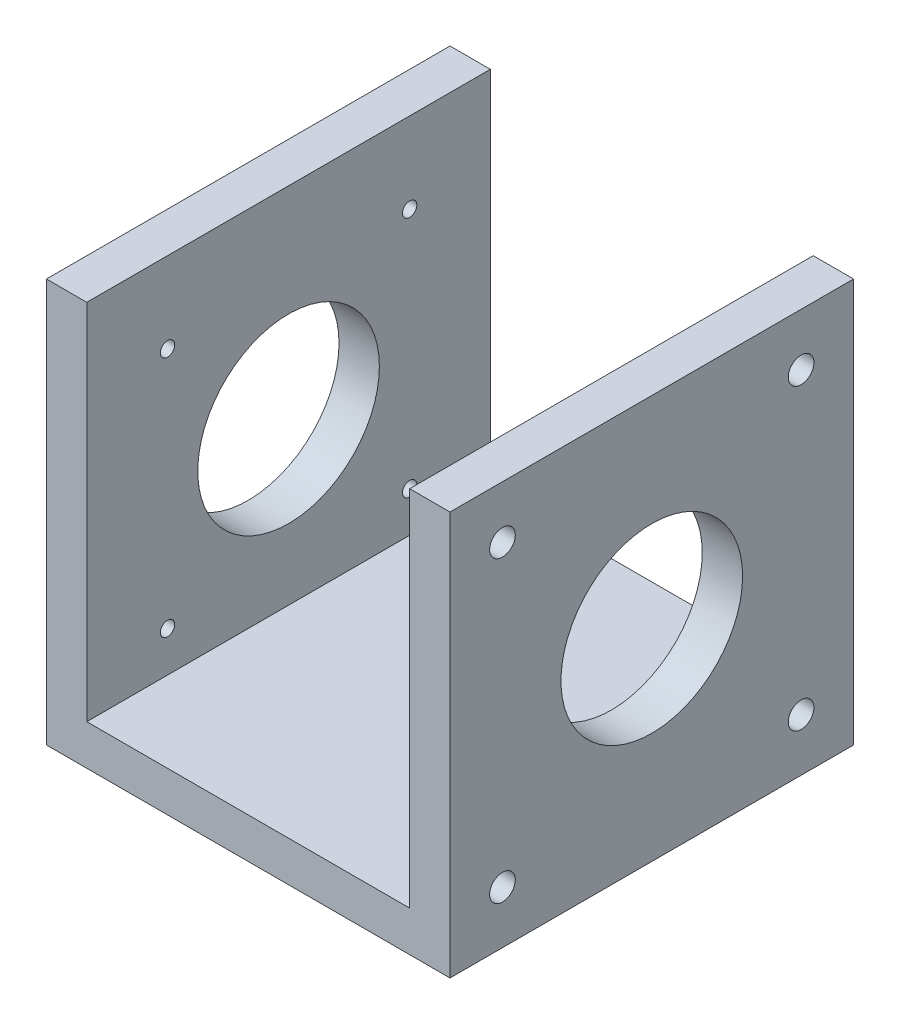
ISO-10303-21;
HEADER;
FILE_DESCRIPTION(('STEP AP214'),'2;1');
FILE_NAME('part.step','',(''),(''),'','','');
FILE_SCHEMA(('AUTOMOTIVE_DESIGN { 1 0 10303 214 1 1 1 1 }'));
ENDSEC;
DATA;
#1=APPLICATION_CONTEXT('core data for automotive mechanical design processes');
#2=APPLICATION_PROTOCOL_DEFINITION('international standard','automotive_design',2000,#1);
#3=PRODUCT_CONTEXT('',#1,'mechanical');
#4=PRODUCT('Part','Part','',(#3));
#5=PRODUCT_RELATED_PRODUCT_CATEGORY('part','',(#4));
#6=PRODUCT_DEFINITION_FORMATION('','',#4);
#7=PRODUCT_DEFINITION_CONTEXT('part definition',#1,'design');
#8=PRODUCT_DEFINITION('design','',#6,#7);
#9=PRODUCT_DEFINITION_SHAPE('','',#8);
#10=(LENGTH_UNIT() NAMED_UNIT(*) SI_UNIT(.MILLI.,.METRE.));
#11=(NAMED_UNIT(*) PLANE_ANGLE_UNIT() SI_UNIT($,.RADIAN.));
#12=(NAMED_UNIT(*) SI_UNIT($,.STERADIAN.) SOLID_ANGLE_UNIT());
#13=UNCERTAINTY_MEASURE_WITH_UNIT(LENGTH_MEASURE(1.E-05),#10,'distance_accuracy_value','');
#14=(GEOMETRIC_REPRESENTATION_CONTEXT(3) GLOBAL_UNCERTAINTY_ASSIGNED_CONTEXT((#13)) GLOBAL_UNIT_ASSIGNED_CONTEXT((#10,
#11,#12)) REPRESENTATION_CONTEXT('',''));
#15=CARTESIAN_POINT('',(0.,0.,0.));
#16=DIRECTION('',(0.,0.,1.));
#17=DIRECTION('',(1.,0.,0.));
#18=AXIS2_PLACEMENT_3D('',#15,#16,#17);
#19=CARTESIAN_POINT('',(0.,63.5,-31.75));
#20=DIRECTION('',(0.,0.,-1.));
#21=DIRECTION('',(-1.,0.,0.));
#22=AXIS2_PLACEMENT_3D('',#19,#20,#21);
#23=PLANE('',#22);
#24=DIRECTION('',(1.,0.,0.));
#25=VECTOR('',#24,1.);
#26=CARTESIAN_POINT('',(0.,0.,-31.75));
#27=LINE('',#26,#25);
#28=CARTESIAN_POINT('',(-31.75,0.,-31.75));
#29=VERTEX_POINT('',#28);
#30=CARTESIAN_POINT('',(31.75,0.,-31.75));
#31=VERTEX_POINT('',#30);
#32=EDGE_CURVE('E273',#29,#31,#27,.T.);
#33=ORIENTED_EDGE('',*,*,#32,.F.);
#34=DIRECTION('',(0.,-1.,0.));
#35=VECTOR('',#34,1.);
#36=CARTESIAN_POINT('',(-31.75,63.5,-31.75));
#37=LINE('',#36,#35);
#38=CARTESIAN_POINT('',(-31.75,63.5,-31.75));
#39=VERTEX_POINT('',#38);
#40=EDGE_CURVE('E169',#39,#29,#37,.T.);
#41=ORIENTED_EDGE('',*,*,#40,.F.);
#42=DIRECTION('',(1.,0.,0.));
#43=VECTOR('',#42,1.);
#44=CARTESIAN_POINT('',(0.,63.5,-31.75));
#45=LINE('',#44,#43);
#46=CARTESIAN_POINT('',(-25.4,63.5,-31.75));
#47=VERTEX_POINT('',#46);
#48=EDGE_CURVE('E191',#39,#47,#45,.T.);
#49=ORIENTED_EDGE('',*,*,#48,.T.);
#50=DIRECTION('',(0.,-1.,0.));
#51=VECTOR('',#50,1.);
#52=CARTESIAN_POINT('',(-25.4,63.5,-31.75));
#53=LINE('',#52,#51);
#54=CARTESIAN_POINT('',(-25.4,6.35,-31.75));
#55=VERTEX_POINT('',#54);
#56=EDGE_CURVE('E164',#47,#55,#53,.T.);
#57=ORIENTED_EDGE('',*,*,#56,.T.);
#58=DIRECTION('',(1.,0.,0.));
#59=VECTOR('',#58,1.);
#60=CARTESIAN_POINT('',(0.,6.35,-31.75));
#61=LINE('',#60,#59);
#62=CARTESIAN_POINT('',(25.4,6.35,-31.75));
#63=VERTEX_POINT('',#62);
#64=EDGE_CURVE('E133',#55,#63,#61,.T.);
#65=ORIENTED_EDGE('',*,*,#64,.T.);
#66=DIRECTION('',(0.,-1.,0.));
#67=VECTOR('',#66,1.);
#68=CARTESIAN_POINT('',(25.4,63.5,-31.75));
#69=LINE('',#68,#67);
#70=CARTESIAN_POINT('',(25.4,63.5,-31.75));
#71=VERTEX_POINT('',#70);
#72=EDGE_CURVE('E132',#71,#63,#69,.T.);
#73=ORIENTED_EDGE('',*,*,#72,.F.);
#74=DIRECTION('',(1.,0.,0.));
#75=VECTOR('',#74,1.);
#76=CARTESIAN_POINT('',(0.,63.5,-31.75));
#77=LINE('',#76,#75);
#78=CARTESIAN_POINT('',(31.75,63.5,-31.75));
#79=VERTEX_POINT('',#78);
#80=EDGE_CURVE('E270',#71,#79,#77,.T.);
#81=ORIENTED_EDGE('',*,*,#80,.T.);
#82=DIRECTION('',(0.,-1.,0.));
#83=VECTOR('',#82,1.);
#84=CARTESIAN_POINT('',(31.75,63.5,-31.75));
#85=LINE('',#84,#83);
#86=EDGE_CURVE('E265',#79,#31,#85,.T.);
#87=ORIENTED_EDGE('',*,*,#86,.T.);
#88=EDGE_LOOP('',(#33,#41,#49,#57,#65,#73,#81,#87));
#89=FACE_BOUND('',#88,.T.);
#90=ADVANCED_FACE('F35',(#89),#23,.T.);
#91=CARTESIAN_POINT('',(25.4,63.5,0.));
#92=DIRECTION('',(1.,0.,0.));
#93=DIRECTION('',(0.,0.,-1.));
#94=AXIS2_PLACEMENT_3D('',#91,#92,#93);
#95=PLANE('',#94);
#96=CARTESIAN_POINT('',(25.4,55.245,23.495));
#97=DIRECTION('',(1.,0.,0.));
#98=DIRECTION('',(0.,0.,-1.));
#99=AXIS2_PLACEMENT_3D('',#96,#97,#98);
#100=CIRCLE('',#99,2.01929999999999);
#101=CARTESIAN_POINT('',(25.4,55.245,21.4757));
#102=VERTEX_POINT('',#101);
#103=EDGE_CURVE('E235',#102,#102,#100,.T.);
#104=ORIENTED_EDGE('',*,*,#103,.T.);
#105=EDGE_LOOP('',(#104));
#106=FACE_BOUND('',#105,.T.);
#107=CARTESIAN_POINT('',(25.4,55.245,-23.495));
#108=DIRECTION('',(1.,0.,0.));
#109=DIRECTION('',(0.,0.,-1.));
#110=AXIS2_PLACEMENT_3D('',#107,#108,#109);
#111=CIRCLE('',#110,2.01929999999999);
#112=CARTESIAN_POINT('',(25.4,55.245,-25.5143));
#113=VERTEX_POINT('',#112);
#114=EDGE_CURVE('E229',#113,#113,#111,.T.);
#115=ORIENTED_EDGE('',*,*,#114,.T.);
#116=EDGE_LOOP('',(#115));
#117=FACE_BOUND('',#116,.T.);
#118=CARTESIAN_POINT('',(25.4,31.75,0.));
#119=DIRECTION('',(1.,0.,0.));
#120=DIRECTION('',(0.,0.,-1.));
#121=AXIS2_PLACEMENT_3D('',#118,#119,#120);
#122=CIRCLE('',#121,14.2875);
#123=CARTESIAN_POINT('',(25.4,31.75,-14.2875));
#124=VERTEX_POINT('',#123);
#125=EDGE_CURVE('E185',#124,#124,#122,.T.);
#126=ORIENTED_EDGE('',*,*,#125,.T.);
#127=EDGE_LOOP('',(#126));
#128=FACE_BOUND('',#127,.T.);
#129=DIRECTION('',(0.,0.,1.));
#130=VECTOR('',#129,1.);
#131=CARTESIAN_POINT('',(25.4,6.35,0.));
#132=LINE('',#131,#130);
#133=CARTESIAN_POINT('',(25.4,6.35,-24.1647368811705));
#134=VERTEX_POINT('',#133);
#135=EDGE_CURVE('E124',#63,#134,#132,.T.);
#136=ORIENTED_EDGE('',*,*,#135,.T.);
#137=CARTESIAN_POINT('',(25.4,8.255,-23.495));
#138=DIRECTION('',(1.,0.,0.));
#139=DIRECTION('',(0.,0.,-1.));
#140=AXIS2_PLACEMENT_3D('',#137,#138,#139);
#141=CIRCLE('',#140,2.01929999999999);
#142=CARTESIAN_POINT('',(25.4,6.35,-22.8252631188295));
#143=VERTEX_POINT('',#142);
#144=EDGE_CURVE('E11',#134,#143,#141,.T.);
#145=ORIENTED_EDGE('',*,*,#144,.T.);
#146=CARTESIAN_POINT('',(25.4,6.35,22.8252631188295));
#147=VERTEX_POINT('',#146);
#148=EDGE_CURVE('E127',#143,#147,#132,.T.);
#149=ORIENTED_EDGE('',*,*,#148,.T.);
#150=CARTESIAN_POINT('',(25.4,8.255,23.495));
#151=DIRECTION('',(1.,0.,0.));
#152=DIRECTION('',(0.,0.,-1.));
#153=AXIS2_PLACEMENT_3D('',#150,#151,#152);
#154=CIRCLE('',#153,2.01929999999999);
#155=CARTESIAN_POINT('',(25.4,6.35,24.1647368811705));
#156=VERTEX_POINT('',#155);
#157=EDGE_CURVE('E42',#147,#156,#154,.T.);
#158=ORIENTED_EDGE('',*,*,#157,.T.);
#159=CARTESIAN_POINT('',(25.4,6.35,31.75));
#160=VERTEX_POINT('',#159);
#161=EDGE_CURVE('E160',#156,#160,#132,.T.);
#162=ORIENTED_EDGE('',*,*,#161,.T.);
#163=DIRECTION('',(0.,-1.,0.));
#164=VECTOR('',#163,1.);
#165=CARTESIAN_POINT('',(25.4,63.5,31.75));
#166=LINE('',#165,#164);
#167=CARTESIAN_POINT('',(25.4,63.5,31.75));
#168=VERTEX_POINT('',#167);
#169=EDGE_CURVE('E284',#168,#160,#166,.T.);
#170=ORIENTED_EDGE('',*,*,#169,.F.);
#171=DIRECTION('',(0.,0.,1.));
#172=VECTOR('',#171,1.);
#173=CARTESIAN_POINT('',(25.4,63.5,0.));
#174=LINE('',#173,#172);
#175=EDGE_CURVE('E306',#71,#168,#174,.T.);
#176=ORIENTED_EDGE('',*,*,#175,.F.);
#177=ORIENTED_EDGE('',*,*,#72,.T.);
#178=EDGE_LOOP('',(#136,#145,#149,#158,#162,#170,#176,#177));
#179=FACE_BOUND('',#178,.T.);
#180=ADVANCED_FACE('F130',(#106,#117,#128,#179),#95,.F.);
#181=CARTESIAN_POINT('',(0.,63.5,31.75));
#182=DIRECTION('',(0.,0.,-1.));
#183=DIRECTION('',(-1.,0.,0.));
#184=AXIS2_PLACEMENT_3D('',#181,#182,#183);
#185=PLANE('',#184);
#186=DIRECTION('',(1.,0.,0.));
#187=VECTOR('',#186,1.);
#188=CARTESIAN_POINT('',(0.,0.,31.75));
#189=LINE('',#188,#187);
#190=CARTESIAN_POINT('',(-31.75,0.,31.75));
#191=VERTEX_POINT('',#190);
#192=CARTESIAN_POINT('',(31.75,0.,31.75));
#193=VERTEX_POINT('',#192);
#194=EDGE_CURVE('E271',#191,#193,#189,.T.);
#195=ORIENTED_EDGE('',*,*,#194,.T.);
#196=DIRECTION('',(0.,-1.,0.));
#197=VECTOR('',#196,1.);
#198=CARTESIAN_POINT('',(31.75,63.5,31.75));
#199=LINE('',#198,#197);
#200=CARTESIAN_POINT('',(31.75,63.5,31.75));
#201=VERTEX_POINT('',#200);
#202=EDGE_CURVE('E268',#201,#193,#199,.T.);
#203=ORIENTED_EDGE('',*,*,#202,.F.);
#204=DIRECTION('',(1.,0.,0.));
#205=VECTOR('',#204,1.);
#206=CARTESIAN_POINT('',(0.,63.5,31.75));
#207=LINE('',#206,#205);
#208=EDGE_CURVE('E303',#168,#201,#207,.T.);
#209=ORIENTED_EDGE('',*,*,#208,.F.);
#210=ORIENTED_EDGE('',*,*,#169,.T.);
#211=DIRECTION('',(1.,0.,0.));
#212=VECTOR('',#211,1.);
#213=CARTESIAN_POINT('',(0.,6.35,31.75));
#214=LINE('',#213,#212);
#215=CARTESIAN_POINT('',(-25.4,6.35,31.75));
#216=VERTEX_POINT('',#215);
#217=EDGE_CURVE('E142',#216,#160,#214,.T.);
#218=ORIENTED_EDGE('',*,*,#217,.F.);
#219=DIRECTION('',(0.,-1.,0.));
#220=VECTOR('',#219,1.);
#221=CARTESIAN_POINT('',(-25.4,63.5,31.75));
#222=LINE('',#221,#220);
#223=CARTESIAN_POINT('',(-25.4,63.5,31.75));
#224=VERTEX_POINT('',#223);
#225=EDGE_CURVE('E147',#224,#216,#222,.T.);
#226=ORIENTED_EDGE('',*,*,#225,.F.);
#227=DIRECTION('',(1.,0.,0.));
#228=VECTOR('',#227,1.);
#229=CARTESIAN_POINT('',(0.,63.5,31.75));
#230=LINE('',#229,#228);
#231=CARTESIAN_POINT('',(-31.75,63.5,31.75));
#232=VERTEX_POINT('',#231);
#233=EDGE_CURVE('E186',#232,#224,#230,.T.);
#234=ORIENTED_EDGE('',*,*,#233,.F.);
#235=DIRECTION('',(0.,-1.,0.));
#236=VECTOR('',#235,1.);
#237=CARTESIAN_POINT('',(-31.75,63.5,31.75));
#238=LINE('',#237,#236);
#239=EDGE_CURVE('E173',#232,#191,#238,.T.);
#240=ORIENTED_EDGE('',*,*,#239,.T.);
#241=EDGE_LOOP('',(#195,#203,#209,#210,#218,#226,#234,#240));
#242=FACE_BOUND('',#241,.T.);
#243=ADVANCED_FACE('F248',(#242),#185,.F.);
#244=CARTESIAN_POINT('',(31.75,63.5,0.));
#245=DIRECTION('',(-1.,0.,0.));
#246=DIRECTION('',(0.,0.,1.));
#247=AXIS2_PLACEMENT_3D('',#244,#245,#246);
#248=PLANE('',#247);
#249=CARTESIAN_POINT('',(31.75,55.245,23.495));
#250=DIRECTION('',(1.,0.,0.));
#251=DIRECTION('',(0.,0.,-1.));
#252=AXIS2_PLACEMENT_3D('',#249,#250,#251);
#253=CIRCLE('',#252,2.01929999999999);
#254=CARTESIAN_POINT('',(31.75,55.245,21.4757));
#255=VERTEX_POINT('',#254);
#256=EDGE_CURVE('E238',#255,#255,#253,.T.);
#257=ORIENTED_EDGE('',*,*,#256,.F.);
#258=EDGE_LOOP('',(#257));
#259=FACE_BOUND('',#258,.T.);
#260=CARTESIAN_POINT('',(31.75,55.245,-23.495));
#261=DIRECTION('',(1.,0.,0.));
#262=DIRECTION('',(0.,0.,-1.));
#263=AXIS2_PLACEMENT_3D('',#260,#261,#262);
#264=CIRCLE('',#263,2.01929999999999);
#265=CARTESIAN_POINT('',(31.75,55.245,-25.5143));
#266=VERTEX_POINT('',#265);
#267=EDGE_CURVE('E232',#266,#266,#264,.T.);
#268=ORIENTED_EDGE('',*,*,#267,.F.);
#269=EDGE_LOOP('',(#268));
#270=FACE_BOUND('',#269,.T.);
#271=CARTESIAN_POINT('',(31.75,8.255,-23.495));
#272=DIRECTION('',(1.,0.,0.));
#273=DIRECTION('',(0.,0.,-1.));
#274=AXIS2_PLACEMENT_3D('',#271,#272,#273);
#275=CIRCLE('',#274,2.01929999999999);
#276=CARTESIAN_POINT('',(31.75,8.255,-25.5143));
#277=VERTEX_POINT('',#276);
#278=EDGE_CURVE('E119',#277,#277,#275,.T.);
#279=ORIENTED_EDGE('',*,*,#278,.F.);
#280=EDGE_LOOP('',(#279));
#281=FACE_BOUND('',#280,.T.);
#282=CARTESIAN_POINT('',(31.75,8.255,23.495));
#283=DIRECTION('',(1.,0.,0.));
#284=DIRECTION('',(0.,0.,-1.));
#285=AXIS2_PLACEMENT_3D('',#282,#283,#284);
#286=CIRCLE('',#285,2.01929999999999);
#287=CARTESIAN_POINT('',(31.75,8.255,21.4757));
#288=VERTEX_POINT('',#287);
#289=EDGE_CURVE('E118',#288,#288,#286,.T.);
#290=ORIENTED_EDGE('',*,*,#289,.F.);
#291=EDGE_LOOP('',(#290));
#292=FACE_BOUND('',#291,.T.);
#293=CARTESIAN_POINT('',(31.75,31.75,0.));
#294=DIRECTION('',(1.,0.,0.));
#295=DIRECTION('',(0.,0.,-1.));
#296=AXIS2_PLACEMENT_3D('',#293,#294,#295);
#297=CIRCLE('',#296,14.2875);
#298=CARTESIAN_POINT('',(31.75,31.75,-14.2875));
#299=VERTEX_POINT('',#298);
#300=EDGE_CURVE('E201',#299,#299,#297,.T.);
#301=ORIENTED_EDGE('',*,*,#300,.F.);
#302=EDGE_LOOP('',(#301));
#303=FACE_BOUND('',#302,.T.);
#304=DIRECTION('',(0.,0.,-1.));
#305=VECTOR('',#304,1.);
#306=CARTESIAN_POINT('',(31.75,0.,0.));
#307=LINE('',#306,#305);
#308=EDGE_CURVE('E262',#193,#31,#307,.T.);
#309=ORIENTED_EDGE('',*,*,#308,.T.);
#310=ORIENTED_EDGE('',*,*,#86,.F.);
#311=DIRECTION('',(0.,0.,-1.));
#312=VECTOR('',#311,1.);
#313=CARTESIAN_POINT('',(31.75,63.5,0.));
#314=LINE('',#313,#312);
#315=EDGE_CURVE('E279',#201,#79,#314,.T.);
#316=ORIENTED_EDGE('',*,*,#315,.F.);
#317=ORIENTED_EDGE('',*,*,#202,.T.);
#318=EDGE_LOOP('',(#309,#310,#316,#317));
#319=FACE_BOUND('',#318,.T.);
#320=ADVANCED_FACE('F244',(#259,#270,#281,#292,#303,#319),#248,.F.);
#321=CARTESIAN_POINT('',(0.,63.5,0.));
#322=DIRECTION('',(0.,1.,0.));
#323=DIRECTION('',(0.,0.,1.));
#324=AXIS2_PLACEMENT_3D('',#321,#322,#323);
#325=PLANE('',#324);
#326=ORIENTED_EDGE('',*,*,#80,.F.);
#327=ORIENTED_EDGE('',*,*,#175,.T.);
#328=ORIENTED_EDGE('',*,*,#208,.T.);
#329=ORIENTED_EDGE('',*,*,#315,.T.);
#330=EDGE_LOOP('',(#326,#327,#328,#329));
#331=FACE_BOUND('',#330,.T.);
#332=ADVANCED_FACE('F247',(#331),#325,.T.);
#333=CARTESIAN_POINT('',(0.,0.,0.));
#334=DIRECTION('',(0.,1.,0.));
#335=DIRECTION('',(0.,0.,1.));
#336=AXIS2_PLACEMENT_3D('',#333,#334,#335);
#337=PLANE('',#336);
#338=ORIENTED_EDGE('',*,*,#32,.T.);
#339=ORIENTED_EDGE('',*,*,#308,.F.);
#340=ORIENTED_EDGE('',*,*,#194,.F.);
#341=DIRECTION('',(0.,0.,-1.));
#342=VECTOR('',#341,1.);
#343=CARTESIAN_POINT('',(-31.75,0.,0.));
#344=LINE('',#343,#342);
#345=EDGE_CURVE('E181',#191,#29,#344,.T.);
#346=ORIENTED_EDGE('',*,*,#345,.T.);
#347=EDGE_LOOP('',(#338,#339,#340,#346));
#348=FACE_BOUND('',#347,.T.);
#349=ADVANCED_FACE('F274',(#348),#337,.F.);
#350=CARTESIAN_POINT('',(0.,6.35,0.));
#351=DIRECTION('',(0.,1.,0.));
#352=DIRECTION('',(0.,0.,1.));
#353=AXIS2_PLACEMENT_3D('',#350,#351,#352);
#354=PLANE('',#353);
#355=ORIENTED_EDGE('',*,*,#135,.F.);
#356=ORIENTED_EDGE('',*,*,#64,.F.);
#357=DIRECTION('',(0.,0.,1.));
#358=VECTOR('',#357,1.);
#359=CARTESIAN_POINT('',(-25.4,6.35,0.));
#360=LINE('',#359,#358);
#361=EDGE_CURVE('E135',#55,#216,#360,.T.);
#362=ORIENTED_EDGE('',*,*,#361,.T.);
#363=ORIENTED_EDGE('',*,*,#217,.T.);
#364=ORIENTED_EDGE('',*,*,#161,.F.);
#365=EDGE_CURVE('E157',#147,#156,#132,.T.);
#366=ORIENTED_EDGE('',*,*,#365,.F.);
#367=ORIENTED_EDGE('',*,*,#148,.F.);
#368=EDGE_CURVE('E117',#134,#143,#132,.T.);
#369=ORIENTED_EDGE('',*,*,#368,.F.);
#370=EDGE_LOOP('',(#355,#356,#362,#363,#364,#366,#367,#369));
#371=FACE_BOUND('',#370,.T.);
#372=ADVANCED_FACE('F122',(#371),#354,.T.);
#373=CARTESIAN_POINT('',(-25.4,63.5,0.));
#374=DIRECTION('',(1.,0.,0.));
#375=DIRECTION('',(0.,0.,-1.));
#376=AXIS2_PLACEMENT_3D('',#373,#374,#375);
#377=PLANE('',#376);
#378=CARTESIAN_POINT('',(-25.4,50.8,-19.05));
#379=DIRECTION('',(1.,0.,0.));
#380=DIRECTION('',(0.,0.,-1.));
#381=AXIS2_PLACEMENT_3D('',#378,#379,#380);
#382=CIRCLE('',#381,1.13029999999999);
#383=CARTESIAN_POINT('',(-25.4,50.8,-20.1803));
#384=VERTEX_POINT('',#383);
#385=EDGE_CURVE('E220',#384,#384,#382,.T.);
#386=ORIENTED_EDGE('',*,*,#385,.F.);
#387=EDGE_LOOP('',(#386));
#388=FACE_BOUND('',#387,.T.);
#389=CARTESIAN_POINT('',(-25.4,50.8,19.05));
#390=DIRECTION('',(1.,0.,0.));
#391=DIRECTION('',(0.,0.,-1.));
#392=AXIS2_PLACEMENT_3D('',#389,#390,#391);
#393=CIRCLE('',#392,1.13029999999999);
#394=CARTESIAN_POINT('',(-25.4,50.8,17.9197));
#395=VERTEX_POINT('',#394);
#396=EDGE_CURVE('E216',#395,#395,#393,.T.);
#397=ORIENTED_EDGE('',*,*,#396,.F.);
#398=EDGE_LOOP('',(#397));
#399=FACE_BOUND('',#398,.T.);
#400=CARTESIAN_POINT('',(-25.4,12.7,19.05));
#401=DIRECTION('',(1.,0.,0.));
#402=DIRECTION('',(0.,0.,-1.));
#403=AXIS2_PLACEMENT_3D('',#400,#401,#402);
#404=CIRCLE('',#403,1.1303);
#405=CARTESIAN_POINT('',(-25.4,12.7,17.9197));
#406=VERTEX_POINT('',#405);
#407=EDGE_CURVE('E210',#406,#406,#404,.T.);
#408=ORIENTED_EDGE('',*,*,#407,.F.);
#409=EDGE_LOOP('',(#408));
#410=FACE_BOUND('',#409,.T.);
#411=CARTESIAN_POINT('',(-25.4,12.7,-19.05));
#412=DIRECTION('',(1.,0.,0.));
#413=DIRECTION('',(0.,0.,-1.));
#414=AXIS2_PLACEMENT_3D('',#411,#412,#413);
#415=CIRCLE('',#414,1.1303);
#416=CARTESIAN_POINT('',(-25.4,12.7,-20.1803));
#417=VERTEX_POINT('',#416);
#418=EDGE_CURVE('E204',#417,#417,#415,.T.);
#419=ORIENTED_EDGE('',*,*,#418,.F.);
#420=EDGE_LOOP('',(#419));
#421=FACE_BOUND('',#420,.T.);
#422=CARTESIAN_POINT('',(-25.4,31.75,0.));
#423=DIRECTION('',(1.,0.,0.));
#424=DIRECTION('',(0.,0.,-1.));
#425=AXIS2_PLACEMENT_3D('',#422,#423,#424);
#426=CIRCLE('',#425,14.2875);
#427=CARTESIAN_POINT('',(-25.4,31.75,-14.2875));
#428=VERTEX_POINT('',#427);
#429=EDGE_CURVE('E197',#428,#428,#426,.T.);
#430=ORIENTED_EDGE('',*,*,#429,.F.);
#431=EDGE_LOOP('',(#430));
#432=FACE_BOUND('',#431,.T.);
#433=ORIENTED_EDGE('',*,*,#361,.F.);
#434=ORIENTED_EDGE('',*,*,#56,.F.);
#435=DIRECTION('',(0.,0.,1.));
#436=VECTOR('',#435,1.);
#437=CARTESIAN_POINT('',(-25.4,63.5,0.));
#438=LINE('',#437,#436);
#439=EDGE_CURVE('E184',#47,#224,#438,.T.);
#440=ORIENTED_EDGE('',*,*,#439,.T.);
#441=ORIENTED_EDGE('',*,*,#225,.T.);
#442=EDGE_LOOP('',(#433,#434,#440,#441));
#443=FACE_BOUND('',#442,.T.);
#444=ADVANCED_FACE('F297',(#388,#399,#410,#421,#432,#443),#377,.T.);
#445=CARTESIAN_POINT('',(-31.75,63.5,0.));
#446=DIRECTION('',(-1.,0.,0.));
#447=DIRECTION('',(0.,0.,1.));
#448=AXIS2_PLACEMENT_3D('',#445,#446,#447);
#449=PLANE('',#448);
#450=CARTESIAN_POINT('',(-31.75,50.8,-19.05));
#451=DIRECTION('',(-1.,0.,0.));
#452=DIRECTION('',(0.,0.,1.));
#453=AXIS2_PLACEMENT_3D('',#450,#451,#452);
#454=CIRCLE('',#453,1.13029999999999);
#455=CARTESIAN_POINT('',(-31.75,50.8,-17.9197));
#456=VERTEX_POINT('',#455);
#457=EDGE_CURVE('E221',#456,#456,#454,.T.);
#458=ORIENTED_EDGE('',*,*,#457,.F.);
#459=EDGE_LOOP('',(#458));
#460=FACE_BOUND('',#459,.T.);
#461=CARTESIAN_POINT('',(-31.75,50.8,19.05));
#462=DIRECTION('',(-1.,0.,0.));
#463=DIRECTION('',(0.,0.,1.));
#464=AXIS2_PLACEMENT_3D('',#461,#462,#463);
#465=CIRCLE('',#464,1.13029999999999);
#466=CARTESIAN_POINT('',(-31.75,50.8,20.1803));
#467=VERTEX_POINT('',#466);
#468=EDGE_CURVE('E217',#467,#467,#465,.T.);
#469=ORIENTED_EDGE('',*,*,#468,.F.);
#470=EDGE_LOOP('',(#469));
#471=FACE_BOUND('',#470,.T.);
#472=CARTESIAN_POINT('',(-31.75,12.7,19.05));
#473=DIRECTION('',(-1.,0.,0.));
#474=DIRECTION('',(0.,0.,1.));
#475=AXIS2_PLACEMENT_3D('',#472,#473,#474);
#476=CIRCLE('',#475,1.1303);
#477=CARTESIAN_POINT('',(-31.75,12.7,20.1803));
#478=VERTEX_POINT('',#477);
#479=EDGE_CURVE('E213',#478,#478,#476,.T.);
#480=ORIENTED_EDGE('',*,*,#479,.F.);
#481=EDGE_LOOP('',(#480));
#482=FACE_BOUND('',#481,.T.);
#483=CARTESIAN_POINT('',(-31.75,12.7,-19.05));
#484=DIRECTION('',(-1.,0.,0.));
#485=DIRECTION('',(0.,0.,1.));
#486=AXIS2_PLACEMENT_3D('',#483,#484,#485);
#487=CIRCLE('',#486,1.1303);
#488=CARTESIAN_POINT('',(-31.75,12.7,-17.9197));
#489=VERTEX_POINT('',#488);
#490=EDGE_CURVE('E207',#489,#489,#487,.T.);
#491=ORIENTED_EDGE('',*,*,#490,.F.);
#492=EDGE_LOOP('',(#491));
#493=FACE_BOUND('',#492,.T.);
#494=CARTESIAN_POINT('',(-31.75,31.75,0.));
#495=DIRECTION('',(1.,0.,0.));
#496=DIRECTION('',(0.,0.,-1.));
#497=AXIS2_PLACEMENT_3D('',#494,#495,#496);
#498=CIRCLE('',#497,14.2875);
#499=CARTESIAN_POINT('',(-31.75,31.75,-14.2875));
#500=VERTEX_POINT('',#499);
#501=EDGE_CURVE('E200',#500,#500,#498,.T.);
#502=ORIENTED_EDGE('',*,*,#501,.T.);
#503=EDGE_LOOP('',(#502));
#504=FACE_BOUND('',#503,.T.);
#505=ORIENTED_EDGE('',*,*,#345,.F.);
#506=ORIENTED_EDGE('',*,*,#239,.F.);
#507=DIRECTION('',(0.,0.,-1.));
#508=VECTOR('',#507,1.);
#509=CARTESIAN_POINT('',(-31.75,63.5,0.));
#510=LINE('',#509,#508);
#511=EDGE_CURVE('E188',#232,#39,#510,.T.);
#512=ORIENTED_EDGE('',*,*,#511,.T.);
#513=ORIENTED_EDGE('',*,*,#40,.T.);
#514=EDGE_LOOP('',(#505,#506,#512,#513));
#515=FACE_BOUND('',#514,.T.);
#516=ADVANCED_FACE('F302',(#460,#471,#482,#493,#504,#515),#449,.T.);
#517=CARTESIAN_POINT('',(0.,63.5,0.));
#518=DIRECTION('',(0.,1.,0.));
#519=DIRECTION('',(0.,0.,1.));
#520=AXIS2_PLACEMENT_3D('',#517,#518,#519);
#521=PLANE('',#520);
#522=ORIENTED_EDGE('',*,*,#439,.F.);
#523=ORIENTED_EDGE('',*,*,#48,.F.);
#524=ORIENTED_EDGE('',*,*,#511,.F.);
#525=ORIENTED_EDGE('',*,*,#233,.T.);
#526=EDGE_LOOP('',(#522,#523,#524,#525));
#527=FACE_BOUND('',#526,.T.);
#528=ADVANCED_FACE('F300',(#527),#521,.T.);
#529=CARTESIAN_POINT('',(-31.75,31.75,0.));
#530=DIRECTION('',(1.,0.,0.));
#531=DIRECTION('',(0.,0.,-1.));
#532=AXIS2_PLACEMENT_3D('',#529,#530,#531);
#533=CYLINDRICAL_SURFACE('',#532,14.2875);
#534=ORIENTED_EDGE('',*,*,#429,.T.);
#535=EDGE_LOOP('',(#534));
#536=FACE_BOUND('',#535,.T.);
#537=ORIENTED_EDGE('',*,*,#501,.F.);
#538=EDGE_LOOP('',(#537));
#539=FACE_BOUND('',#538,.T.);
#540=ADVANCED_FACE('F333',(#536,#539),#533,.F.);
#541=ORIENTED_EDGE('',*,*,#300,.T.);
#542=EDGE_LOOP('',(#541));
#543=FACE_BOUND('',#542,.T.);
#544=ORIENTED_EDGE('',*,*,#125,.F.);
#545=EDGE_LOOP('',(#544));
#546=FACE_BOUND('',#545,.T.);
#547=ADVANCED_FACE('F330',(#543,#546),#533,.F.);
#548=CARTESIAN_POINT('',(-31.75,12.7,-19.05));
#549=DIRECTION('',(-1.,0.,0.));
#550=DIRECTION('',(0.,0.,1.));
#551=AXIS2_PLACEMENT_3D('',#548,#549,#550);
#552=CYLINDRICAL_SURFACE('',#551,1.1303);
#553=ORIENTED_EDGE('',*,*,#418,.T.);
#554=EDGE_LOOP('',(#553));
#555=FACE_BOUND('',#554,.T.);
#556=ORIENTED_EDGE('',*,*,#490,.T.);
#557=EDGE_LOOP('',(#556));
#558=FACE_BOUND('',#557,.T.);
#559=ADVANCED_FACE('F332',(#555,#558),#552,.F.);
#560=CARTESIAN_POINT('',(-31.75,12.7,19.05));
#561=DIRECTION('',(-1.,0.,0.));
#562=DIRECTION('',(0.,0.,1.));
#563=AXIS2_PLACEMENT_3D('',#560,#561,#562);
#564=CYLINDRICAL_SURFACE('',#563,1.1303);
#565=ORIENTED_EDGE('',*,*,#407,.T.);
#566=EDGE_LOOP('',(#565));
#567=FACE_BOUND('',#566,.T.);
#568=ORIENTED_EDGE('',*,*,#479,.T.);
#569=EDGE_LOOP('',(#568));
#570=FACE_BOUND('',#569,.T.);
#571=ADVANCED_FACE('F340',(#567,#570),#564,.F.);
#572=CARTESIAN_POINT('',(-31.75,50.8,19.05));
#573=DIRECTION('',(-1.,0.,0.));
#574=DIRECTION('',(0.,0.,1.));
#575=AXIS2_PLACEMENT_3D('',#572,#573,#574);
#576=CYLINDRICAL_SURFACE('',#575,1.13029999999999);
#577=ORIENTED_EDGE('',*,*,#396,.T.);
#578=EDGE_LOOP('',(#577));
#579=FACE_BOUND('',#578,.T.);
#580=ORIENTED_EDGE('',*,*,#468,.T.);
#581=EDGE_LOOP('',(#580));
#582=FACE_BOUND('',#581,.T.);
#583=ADVANCED_FACE('F395',(#579,#582),#576,.F.);
#584=CARTESIAN_POINT('',(-31.75,50.8,-19.05));
#585=DIRECTION('',(-1.,0.,0.));
#586=DIRECTION('',(0.,0.,1.));
#587=AXIS2_PLACEMENT_3D('',#584,#585,#586);
#588=CYLINDRICAL_SURFACE('',#587,1.13029999999999);
#589=ORIENTED_EDGE('',*,*,#385,.T.);
#590=EDGE_LOOP('',(#589));
#591=FACE_BOUND('',#590,.T.);
#592=ORIENTED_EDGE('',*,*,#457,.T.);
#593=EDGE_LOOP('',(#592));
#594=FACE_BOUND('',#593,.T.);
#595=ADVANCED_FACE('F403',(#591,#594),#588,.F.);
#596=CARTESIAN_POINT('',(25.4,63.5,0.));
#597=DIRECTION('',(1.,0.,0.));
#598=DIRECTION('',(0.,0.,-1.));
#599=AXIS2_PLACEMENT_3D('',#596,#597,#598);
#600=PLANE('',#599);
#601=ORIENTED_EDGE('',*,*,#365,.T.);
#602=CARTESIAN_POINT('',(25.4,8.255,23.495));
#603=DIRECTION('',(1.,0.,0.));
#604=DIRECTION('',(0.,0.,-1.));
#605=AXIS2_PLACEMENT_3D('',#602,#603,#604);
#606=CIRCLE('',#605,2.01929999999999);
#607=EDGE_CURVE('E55',#147,#156,#606,.F.);
#608=ORIENTED_EDGE('',*,*,#607,.F.);
#609=EDGE_LOOP('',(#601,#608));
#610=FACE_BOUND('',#609,.T.);
#611=ADVANCED_FACE('F412',(#610),#600,.T.);
#612=CARTESIAN_POINT('',(31.75,8.255,23.495));
#613=DIRECTION('',(1.,0.,0.));
#614=DIRECTION('',(0.,0.,-1.));
#615=AXIS2_PLACEMENT_3D('',#612,#613,#614);
#616=CYLINDRICAL_SURFACE('',#615,2.01929999999999);
#617=ORIENTED_EDGE('',*,*,#607,.T.);
#618=ORIENTED_EDGE('',*,*,#157,.F.);
#619=EDGE_LOOP('',(#617,#618));
#620=FACE_BOUND('',#619,.T.);
#621=ORIENTED_EDGE('',*,*,#289,.T.);
#622=EDGE_LOOP('',(#621));
#623=FACE_BOUND('',#622,.T.);
#624=ADVANCED_FACE('F420',(#620,#623),#616,.F.);
#625=CARTESIAN_POINT('',(25.4,63.5,0.));
#626=DIRECTION('',(1.,0.,0.));
#627=DIRECTION('',(0.,0.,-1.));
#628=AXIS2_PLACEMENT_3D('',#625,#626,#627);
#629=PLANE('',#628);
#630=ORIENTED_EDGE('',*,*,#368,.T.);
#631=CARTESIAN_POINT('',(25.4,8.255,-23.495));
#632=DIRECTION('',(1.,0.,0.));
#633=DIRECTION('',(0.,0.,-1.));
#634=AXIS2_PLACEMENT_3D('',#631,#632,#633);
#635=CIRCLE('',#634,2.01929999999999);
#636=EDGE_CURVE('E48',#134,#143,#635,.F.);
#637=ORIENTED_EDGE('',*,*,#636,.F.);
#638=EDGE_LOOP('',(#630,#637));
#639=FACE_BOUND('',#638,.T.);
#640=ADVANCED_FACE('F116',(#639),#629,.T.);
#641=CARTESIAN_POINT('',(31.75,8.255,-23.495));
#642=DIRECTION('',(1.,0.,0.));
#643=DIRECTION('',(0.,0.,-1.));
#644=AXIS2_PLACEMENT_3D('',#641,#642,#643);
#645=CYLINDRICAL_SURFACE('',#644,2.01929999999999);
#646=ORIENTED_EDGE('',*,*,#636,.T.);
#647=ORIENTED_EDGE('',*,*,#144,.F.);
#648=EDGE_LOOP('',(#646,#647));
#649=FACE_BOUND('',#648,.T.);
#650=ORIENTED_EDGE('',*,*,#278,.T.);
#651=EDGE_LOOP('',(#650));
#652=FACE_BOUND('',#651,.T.);
#653=ADVANCED_FACE('F109',(#649,#652),#645,.F.);
#654=CARTESIAN_POINT('',(31.75,55.245,-23.495));
#655=DIRECTION('',(1.,0.,0.));
#656=DIRECTION('',(0.,0.,-1.));
#657=AXIS2_PLACEMENT_3D('',#654,#655,#656);
#658=CYLINDRICAL_SURFACE('',#657,2.01929999999999);
#659=ORIENTED_EDGE('',*,*,#114,.F.);
#660=EDGE_LOOP('',(#659));
#661=FACE_BOUND('',#660,.T.);
#662=ORIENTED_EDGE('',*,*,#267,.T.);
#663=EDGE_LOOP('',(#662));
#664=FACE_BOUND('',#663,.T.);
#665=ADVANCED_FACE('F442',(#661,#664),#658,.F.);
#666=CARTESIAN_POINT('',(31.75,55.245,23.495));
#667=DIRECTION('',(1.,0.,0.));
#668=DIRECTION('',(0.,0.,-1.));
#669=AXIS2_PLACEMENT_3D('',#666,#667,#668);
#670=CYLINDRICAL_SURFACE('',#669,2.01929999999999);
#671=ORIENTED_EDGE('',*,*,#103,.F.);
#672=EDGE_LOOP('',(#671));
#673=FACE_BOUND('',#672,.T.);
#674=ORIENTED_EDGE('',*,*,#256,.T.);
#675=EDGE_LOOP('',(#674));
#676=FACE_BOUND('',#675,.T.);
#677=ADVANCED_FACE('F242',(#673,#676),#670,.F.);
#678=CLOSED_SHELL('',(#90,#180,#243,#320,#332,#349,#372,#444,#516,#528,#540,#547,#559,#571,#583,
#595,#611,#624,#640,#653,#665,#677));
#679=MANIFOLD_SOLID_BREP('B2',#678);
#680=ADVANCED_BREP_SHAPE_REPRESENTATION('',(#18,#679),#14);
#681=SHAPE_DEFINITION_REPRESENTATION(#9,#680);
ENDSEC;
END-ISO-10303-21;
